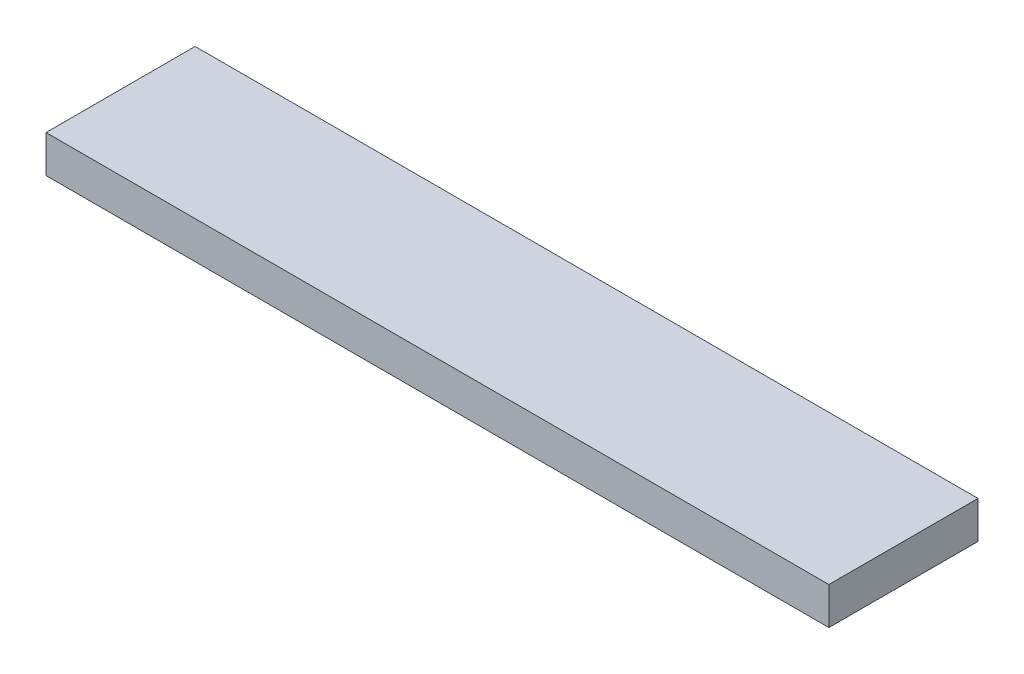
ISO-10303-21;
HEADER;
FILE_DESCRIPTION(('STEP AP214'),'2;1');
FILE_NAME('part.step','',(''),(''),'','','');
FILE_SCHEMA(('AUTOMOTIVE_DESIGN { 1 0 10303 214 1 1 1 1 }'));
ENDSEC;
DATA;
#1=APPLICATION_CONTEXT('core data for automotive mechanical design processes');
#2=APPLICATION_PROTOCOL_DEFINITION('international standard','automotive_design',2000,#1);
#3=PRODUCT_CONTEXT('',#1,'mechanical');
#4=PRODUCT('Part','Part','',(#3));
#5=PRODUCT_RELATED_PRODUCT_CATEGORY('part','',(#4));
#6=PRODUCT_DEFINITION_FORMATION('','',#4);
#7=PRODUCT_DEFINITION_CONTEXT('part definition',#1,'design');
#8=PRODUCT_DEFINITION('design','',#6,#7);
#9=PRODUCT_DEFINITION_SHAPE('','',#8);
#10=(LENGTH_UNIT() NAMED_UNIT(*) SI_UNIT(.MILLI.,.METRE.));
#11=(NAMED_UNIT(*) PLANE_ANGLE_UNIT() SI_UNIT($,.RADIAN.));
#12=(NAMED_UNIT(*) SI_UNIT($,.STERADIAN.) SOLID_ANGLE_UNIT());
#13=UNCERTAINTY_MEASURE_WITH_UNIT(LENGTH_MEASURE(1.E-05),#10,'distance_accuracy_value','');
#14=(GEOMETRIC_REPRESENTATION_CONTEXT(3) GLOBAL_UNCERTAINTY_ASSIGNED_CONTEXT((#13)) GLOBAL_UNIT_ASSIGNED_CONTEXT((#10,
#11,#12)) REPRESENTATION_CONTEXT('',''));
#15=CARTESIAN_POINT('',(0.,0.,0.));
#16=DIRECTION('',(0.,0.,1.));
#17=DIRECTION('',(1.,0.,0.));
#18=AXIS2_PLACEMENT_3D('',#15,#16,#17);
#19=CARTESIAN_POINT('',(66.675,6.35,12.7));
#20=DIRECTION('',(-1.,0.,0.));
#21=DIRECTION('',(0.,0.,1.));
#22=AXIS2_PLACEMENT_3D('',#19,#20,#21);
#23=PLANE('',#22);
#24=DIRECTION('',(0.,0.,-1.));
#25=VECTOR('',#24,1.);
#26=CARTESIAN_POINT('',(66.675,0.,12.7));
#27=LINE('',#26,#25);
#28=CARTESIAN_POINT('',(66.675,0.,12.7));
#29=VERTEX_POINT('',#28);
#30=CARTESIAN_POINT('',(66.675,0.,-12.7));
#31=VERTEX_POINT('',#30);
#32=EDGE_CURVE('E98',#29,#31,#27,.T.);
#33=ORIENTED_EDGE('',*,*,#32,.T.);
#34=DIRECTION('',(0.,-1.,0.));
#35=VECTOR('',#34,1.);
#36=CARTESIAN_POINT('',(66.675,6.35,-12.7));
#37=LINE('',#36,#35);
#38=CARTESIAN_POINT('',(66.675,6.35,-12.7));
#39=VERTEX_POINT('',#38);
#40=EDGE_CURVE('E11',#39,#31,#37,.T.);
#41=ORIENTED_EDGE('',*,*,#40,.F.);
#42=DIRECTION('',(0.,0.,-1.));
#43=VECTOR('',#42,1.);
#44=CARTESIAN_POINT('',(66.675,6.35,12.7));
#45=LINE('',#44,#43);
#46=CARTESIAN_POINT('',(66.675,6.35,12.7));
#47=VERTEX_POINT('',#46);
#48=EDGE_CURVE('E86',#47,#39,#45,.T.);
#49=ORIENTED_EDGE('',*,*,#48,.F.);
#50=DIRECTION('',(0.,-1.,0.));
#51=VECTOR('',#50,1.);
#52=CARTESIAN_POINT('',(66.675,6.35,12.7));
#53=LINE('',#52,#51);
#54=EDGE_CURVE('E94',#47,#29,#53,.T.);
#55=ORIENTED_EDGE('',*,*,#54,.T.);
#56=EDGE_LOOP('',(#33,#41,#49,#55));
#57=FACE_BOUND('',#56,.T.);
#58=ADVANCED_FACE('F35',(#57),#23,.F.);
#59=CARTESIAN_POINT('',(-66.675,6.35,-12.7));
#60=DIRECTION('',(0.,0.,1.));
#61=DIRECTION('',(1.,0.,0.));
#62=AXIS2_PLACEMENT_3D('',#59,#60,#61);
#63=PLANE('',#62);
#64=DIRECTION('',(-1.,0.,0.));
#65=VECTOR('',#64,1.);
#66=CARTESIAN_POINT('',(-66.675,0.,-12.7));
#67=LINE('',#66,#65);
#68=CARTESIAN_POINT('',(-66.675,0.,-12.7));
#69=VERTEX_POINT('',#68);
#70=EDGE_CURVE('E90',#31,#69,#67,.T.);
#71=ORIENTED_EDGE('',*,*,#70,.T.);
#72=DIRECTION('',(0.,-1.,0.));
#73=VECTOR('',#72,1.);
#74=CARTESIAN_POINT('',(-66.675,6.35,-12.7));
#75=LINE('',#74,#73);
#76=CARTESIAN_POINT('',(-66.675,6.35,-12.7));
#77=VERTEX_POINT('',#76);
#78=EDGE_CURVE('E43',#77,#69,#75,.T.);
#79=ORIENTED_EDGE('',*,*,#78,.F.);
#80=DIRECTION('',(-1.,0.,0.));
#81=VECTOR('',#80,1.);
#82=CARTESIAN_POINT('',(-66.675,6.35,-12.7));
#83=LINE('',#82,#81);
#84=EDGE_CURVE('E81',#39,#77,#83,.T.);
#85=ORIENTED_EDGE('',*,*,#84,.F.);
#86=ORIENTED_EDGE('',*,*,#40,.T.);
#87=EDGE_LOOP('',(#71,#79,#85,#86));
#88=FACE_BOUND('',#87,.T.);
#89=ADVANCED_FACE('F89',(#88),#63,.F.);
#90=CARTESIAN_POINT('',(-66.675,6.35,12.7));
#91=DIRECTION('',(1.,0.,0.));
#92=DIRECTION('',(0.,0.,-1.));
#93=AXIS2_PLACEMENT_3D('',#90,#91,#92);
#94=PLANE('',#93);
#95=DIRECTION('',(0.,0.,1.));
#96=VECTOR('',#95,1.);
#97=CARTESIAN_POINT('',(-66.675,0.,12.7));
#98=LINE('',#97,#96);
#99=CARTESIAN_POINT('',(-66.675,0.,12.7));
#100=VERTEX_POINT('',#99);
#101=EDGE_CURVE('E68',#69,#100,#98,.T.);
#102=ORIENTED_EDGE('',*,*,#101,.T.);
#103=DIRECTION('',(0.,-1.,0.));
#104=VECTOR('',#103,1.);
#105=CARTESIAN_POINT('',(-66.675,6.35,12.7));
#106=LINE('',#105,#104);
#107=CARTESIAN_POINT('',(-66.675,6.35,12.7));
#108=VERTEX_POINT('',#107);
#109=EDGE_CURVE('E91',#108,#100,#106,.T.);
#110=ORIENTED_EDGE('',*,*,#109,.F.);
#111=DIRECTION('',(0.,0.,1.));
#112=VECTOR('',#111,1.);
#113=CARTESIAN_POINT('',(-66.675,6.35,12.7));
#114=LINE('',#113,#112);
#115=EDGE_CURVE('E84',#77,#108,#114,.T.);
#116=ORIENTED_EDGE('',*,*,#115,.F.);
#117=ORIENTED_EDGE('',*,*,#78,.T.);
#118=EDGE_LOOP('',(#102,#110,#116,#117));
#119=FACE_BOUND('',#118,.T.);
#120=ADVANCED_FACE('F92',(#119),#94,.F.);
#121=CARTESIAN_POINT('',(-66.675,6.35,12.7));
#122=DIRECTION('',(0.,0.,-1.));
#123=DIRECTION('',(-1.,0.,0.));
#124=AXIS2_PLACEMENT_3D('',#121,#122,#123);
#125=PLANE('',#124);
#126=DIRECTION('',(1.,0.,0.));
#127=VECTOR('',#126,1.);
#128=CARTESIAN_POINT('',(-66.675,0.,12.7));
#129=LINE('',#128,#127);
#130=EDGE_CURVE('E74',#100,#29,#129,.T.);
#131=ORIENTED_EDGE('',*,*,#130,.T.);
#132=ORIENTED_EDGE('',*,*,#54,.F.);
#133=DIRECTION('',(1.,0.,0.));
#134=VECTOR('',#133,1.);
#135=CARTESIAN_POINT('',(-66.675,6.35,12.7));
#136=LINE('',#135,#134);
#137=EDGE_CURVE('E51',#108,#47,#136,.T.);
#138=ORIENTED_EDGE('',*,*,#137,.F.);
#139=ORIENTED_EDGE('',*,*,#109,.T.);
#140=EDGE_LOOP('',(#131,#132,#138,#139));
#141=FACE_BOUND('',#140,.T.);
#142=ADVANCED_FACE('F105',(#141),#125,.F.);
#143=CARTESIAN_POINT('',(0.,6.35,0.));
#144=DIRECTION('',(0.,-1.,0.));
#145=DIRECTION('',(0.,0.,-1.));
#146=AXIS2_PLACEMENT_3D('',#143,#144,#145);
#147=PLANE('',#146);
#148=ORIENTED_EDGE('',*,*,#48,.T.);
#149=ORIENTED_EDGE('',*,*,#84,.T.);
#150=ORIENTED_EDGE('',*,*,#115,.T.);
#151=ORIENTED_EDGE('',*,*,#137,.T.);
#152=EDGE_LOOP('',(#148,#149,#150,#151));
#153=FACE_BOUND('',#152,.T.);
#154=ADVANCED_FACE('F82',(#153),#147,.F.);
#155=CARTESIAN_POINT('',(0.,0.,0.));
#156=DIRECTION('',(0.,-1.,0.));
#157=DIRECTION('',(0.,0.,-1.));
#158=AXIS2_PLACEMENT_3D('',#155,#156,#157);
#159=PLANE('',#158);
#160=ORIENTED_EDGE('',*,*,#32,.F.);
#161=ORIENTED_EDGE('',*,*,#130,.F.);
#162=ORIENTED_EDGE('',*,*,#101,.F.);
#163=ORIENTED_EDGE('',*,*,#70,.F.);
#164=EDGE_LOOP('',(#160,#161,#162,#163));
#165=FACE_BOUND('',#164,.T.);
#166=ADVANCED_FACE('F108',(#165),#159,.T.);
#167=CLOSED_SHELL('',(#58,#89,#120,#142,#154,#166));
#168=MANIFOLD_SOLID_BREP('B2',#167);
#169=ADVANCED_BREP_SHAPE_REPRESENTATION('',(#18,#168),#14);
#170=SHAPE_DEFINITION_REPRESENTATION(#9,#169);
ENDSEC;
END-ISO-10303-21;
